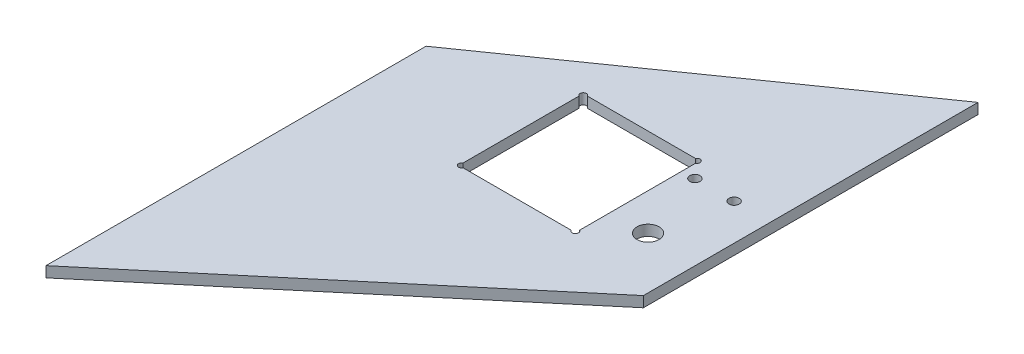
ISO-10303-21;
HEADER;
FILE_DESCRIPTION(('STEP AP214'),'2;1');
FILE_NAME('part.step','',(''),(''),'','','');
FILE_SCHEMA(('AUTOMOTIVE_DESIGN { 1 0 10303 214 1 1 1 1 }'));
ENDSEC;
DATA;
#1=APPLICATION_CONTEXT('core data for automotive mechanical design processes');
#2=APPLICATION_PROTOCOL_DEFINITION('international standard','automotive_design',2000,#1);
#3=PRODUCT_CONTEXT('',#1,'mechanical');
#4=PRODUCT('Part','Part','',(#3));
#5=PRODUCT_RELATED_PRODUCT_CATEGORY('part','',(#4));
#6=PRODUCT_DEFINITION_FORMATION('','',#4);
#7=PRODUCT_DEFINITION_CONTEXT('part definition',#1,'design');
#8=PRODUCT_DEFINITION('design','',#6,#7);
#9=PRODUCT_DEFINITION_SHAPE('','',#8);
#10=(LENGTH_UNIT() NAMED_UNIT(*) SI_UNIT(.MILLI.,.METRE.));
#11=(NAMED_UNIT(*) PLANE_ANGLE_UNIT() SI_UNIT($,.RADIAN.));
#12=(NAMED_UNIT(*) SI_UNIT($,.STERADIAN.) SOLID_ANGLE_UNIT());
#13=UNCERTAINTY_MEASURE_WITH_UNIT(LENGTH_MEASURE(1.E-05),#10,'distance_accuracy_value','');
#14=(GEOMETRIC_REPRESENTATION_CONTEXT(3) GLOBAL_UNCERTAINTY_ASSIGNED_CONTEXT((#13)) GLOBAL_UNIT_ASSIGNED_CONTEXT((#10,
#11,#12)) REPRESENTATION_CONTEXT('',''));
#15=CARTESIAN_POINT('',(0.,0.,0.));
#16=DIRECTION('',(0.,0.,1.));
#17=DIRECTION('',(1.,0.,0.));
#18=AXIS2_PLACEMENT_3D('',#15,#16,#17);
#19=CARTESIAN_POINT('',(0.,-1.27,9.93045313249222));
#20=DIRECTION('',(0.643306704952837,0.,0.765608570591215));
#21=DIRECTION('',(0.765608570591215,0.,-0.643306704952837));
#22=AXIS2_PLACEMENT_3D('',#19,#20,#21);
#23=PLANE('',#22);
#24=DIRECTION('',(0.,1.,0.));
#25=VECTOR('',#24,1.);
#26=CARTESIAN_POINT('',(116.619290139619,-1.27,-88.059530464118));
#27=LINE('',#26,#25);
#28=CARTESIAN_POINT('',(116.619290139619,-1.27,-88.059530464118));
#29=VERTEX_POINT('',#28);
#30=CARTESIAN_POINT('',(116.619290139619,2.54,-88.059530464118));
#31=VERTEX_POINT('',#30);
#32=EDGE_CURVE('E165',#29,#31,#27,.T.);
#33=ORIENTED_EDGE('',*,*,#32,.T.);
#34=DIRECTION('',(0.765608570591215,0.,-0.643306704952837));
#35=VECTOR('',#34,1.);
#36=CARTESIAN_POINT('',(0.,2.54,9.93045313249222));
#37=LINE('',#36,#35);
#38=CARTESIAN_POINT('',(0.,2.54,9.93045313249222));
#39=VERTEX_POINT('',#38);
#40=EDGE_CURVE('E216',#39,#31,#37,.T.);
#41=ORIENTED_EDGE('',*,*,#40,.F.);
#42=DIRECTION('',(0.,1.,0.));
#43=VECTOR('',#42,1.);
#44=CARTESIAN_POINT('',(0.,-1.27,9.93045313249222));
#45=LINE('',#44,#43);
#46=CARTESIAN_POINT('',(0.,-1.27,9.93045313249222));
#47=VERTEX_POINT('',#46);
#48=EDGE_CURVE('E166',#47,#39,#45,.T.);
#49=ORIENTED_EDGE('',*,*,#48,.F.);
#50=DIRECTION('',(0.765608570591215,0.,-0.643306704952837));
#51=VECTOR('',#50,1.);
#52=CARTESIAN_POINT('',(0.,-1.27,9.93045313249222));
#53=LINE('',#52,#51);
#54=EDGE_CURVE('E153',#47,#29,#53,.T.);
#55=ORIENTED_EDGE('',*,*,#54,.T.);
#56=EDGE_LOOP('',(#33,#41,#49,#55));
#57=FACE_BOUND('',#56,.T.);
#58=ADVANCED_FACE('F32',(#57),#23,.T.);
#59=CARTESIAN_POINT('',(0.,-1.27,9.93045313249222));
#60=DIRECTION('',(-1.,0.,0.));
#61=DIRECTION('',(0.,0.,1.));
#62=AXIS2_PLACEMENT_3D('',#59,#60,#61);
#63=PLANE('',#62);
#64=ORIENTED_EDGE('',*,*,#48,.T.);
#65=DIRECTION('',(0.,0.,1.));
#66=VECTOR('',#65,1.);
#67=CARTESIAN_POINT('',(0.,2.54,9.93045313249222));
#68=LINE('',#67,#66);
#69=CARTESIAN_POINT('',(0.,2.54,-126.604027306006));
#70=VERTEX_POINT('',#69);
#71=EDGE_CURVE('E225',#70,#39,#68,.T.);
#72=ORIENTED_EDGE('',*,*,#71,.F.);
#73=DIRECTION('',(0.,1.,0.));
#74=VECTOR('',#73,1.);
#75=CARTESIAN_POINT('',(0.,-1.27,-126.604027306006));
#76=LINE('',#75,#74);
#77=CARTESIAN_POINT('',(0.,-1.27,-126.604027306006));
#78=VERTEX_POINT('',#77);
#79=EDGE_CURVE('E169',#78,#70,#76,.T.);
#80=ORIENTED_EDGE('',*,*,#79,.F.);
#81=DIRECTION('',(0.,0.,1.));
#82=VECTOR('',#81,1.);
#83=CARTESIAN_POINT('',(0.,-1.27,9.93045313249222));
#84=LINE('',#83,#82);
#85=EDGE_CURVE('E162',#78,#47,#84,.T.);
#86=ORIENTED_EDGE('',*,*,#85,.T.);
#87=EDGE_LOOP('',(#64,#72,#80,#86));
#88=FACE_BOUND('',#87,.T.);
#89=ADVANCED_FACE('F249',(#88),#63,.T.);
#90=CARTESIAN_POINT('',(0.,-1.27,-126.604027306006));
#91=DIRECTION('',(-0.573576436351047,0.,-0.819152044288991));
#92=DIRECTION('',(-0.819152044288991,0.,0.573576436351047));
#93=AXIS2_PLACEMENT_3D('',#90,#91,#92);
#94=PLANE('',#93);
#95=ORIENTED_EDGE('',*,*,#79,.T.);
#96=DIRECTION('',(-0.819152044288991,0.,0.573576436351047));
#97=VECTOR('',#96,1.);
#98=CARTESIAN_POINT('',(0.,2.54,-126.604027306006));
#99=LINE('',#98,#97);
#100=CARTESIAN_POINT('',(116.619290139619,2.54,-208.261733362433));
#101=VERTEX_POINT('',#100);
#102=EDGE_CURVE('E222',#101,#70,#99,.T.);
#103=ORIENTED_EDGE('',*,*,#102,.F.);
#104=DIRECTION('',(0.,1.,0.));
#105=VECTOR('',#104,1.);
#106=CARTESIAN_POINT('',(116.619290139619,-1.27,-208.261733362433));
#107=LINE('',#106,#105);
#108=CARTESIAN_POINT('',(116.619290139619,-1.27,-208.261733362433));
#109=VERTEX_POINT('',#108);
#110=EDGE_CURVE('E171',#109,#101,#107,.T.);
#111=ORIENTED_EDGE('',*,*,#110,.F.);
#112=DIRECTION('',(-0.819152044288991,0.,0.573576436351047));
#113=VECTOR('',#112,1.);
#114=CARTESIAN_POINT('',(0.,-1.27,-126.604027306006));
#115=LINE('',#114,#113);
#116=EDGE_CURVE('E159',#109,#78,#115,.T.);
#117=ORIENTED_EDGE('',*,*,#116,.T.);
#118=EDGE_LOOP('',(#95,#103,#111,#117));
#119=FACE_BOUND('',#118,.T.);
#120=ADVANCED_FACE('F254',(#119),#94,.T.);
#121=CARTESIAN_POINT('',(116.619290139619,-1.27,-208.261733362433));
#122=DIRECTION('',(1.,0.,0.));
#123=DIRECTION('',(0.,0.,-1.));
#124=AXIS2_PLACEMENT_3D('',#121,#122,#123);
#125=PLANE('',#124);
#126=ORIENTED_EDGE('',*,*,#110,.T.);
#127=DIRECTION('',(0.,0.,-1.));
#128=VECTOR('',#127,1.);
#129=CARTESIAN_POINT('',(116.619290139619,2.54,-208.261733362433));
#130=LINE('',#129,#128);
#131=EDGE_CURVE('E219',#31,#101,#130,.T.);
#132=ORIENTED_EDGE('',*,*,#131,.F.);
#133=ORIENTED_EDGE('',*,*,#32,.F.);
#134=DIRECTION('',(0.,0.,-1.));
#135=VECTOR('',#134,1.);
#136=CARTESIAN_POINT('',(116.619290139619,-1.27,-208.261733362433));
#137=LINE('',#136,#135);
#138=EDGE_CURVE('E156',#29,#109,#137,.T.);
#139=ORIENTED_EDGE('',*,*,#138,.T.);
#140=EDGE_LOOP('',(#126,#132,#133,#139));
#141=FACE_BOUND('',#140,.T.);
#142=ADVANCED_FACE('F262',(#141),#125,.T.);
#143=CARTESIAN_POINT('',(116.619290139619,-1.27,-88.059530464118));
#144=DIRECTION('',(0.,-1.,0.));
#145=DIRECTION('',(0.,0.,-1.));
#146=AXIS2_PLACEMENT_3D('',#143,#144,#145);
#147=PLANE('',#146);
#148=CARTESIAN_POINT('',(84.3172932249785,-1.27,-95.9237113979477));
#149=DIRECTION('',(0.,1.,0.));
#150=DIRECTION('',(0.,0.,1.));
#151=AXIS2_PLACEMENT_3D('',#148,#149,#150);
#152=CIRCLE('',#151,1.1303);
#153=CARTESIAN_POINT('',(83.3075833210953,-1.27,-95.4157113979477));
#154=VERTEX_POINT('',#153);
#155=CARTESIAN_POINT('',(84.8252932249785,-1.27,-96.933421301831));
#156=VERTEX_POINT('',#155);
#157=EDGE_CURVE('E46',#154,#156,#152,.T.);
#158=ORIENTED_EDGE('',*,*,#157,.T.);
#159=DIRECTION('',(0.,0.,-1.));
#160=VECTOR('',#159,1.);
#161=CARTESIAN_POINT('',(84.8252932249785,-1.27,-138.798911397948));
#162=LINE('',#161,#160);
#163=CARTESIAN_POINT('',(84.8252932249785,-1.27,-138.551201494064));
#164=VERTEX_POINT('',#163);
#165=EDGE_CURVE('E131',#156,#164,#162,.T.);
#166=ORIENTED_EDGE('',*,*,#165,.T.);
#167=CARTESIAN_POINT('',(84.3172932249785,-1.27,-139.560911397948));
#168=DIRECTION('',(0.,1.,0.));
#169=DIRECTION('',(0.,0.,1.));
#170=AXIS2_PLACEMENT_3D('',#167,#168,#169);
#171=CIRCLE('',#170,1.1303);
#172=CARTESIAN_POINT('',(83.3075833210953,-1.27,-140.068911397948));
#173=VERTEX_POINT('',#172);
#174=EDGE_CURVE('E394',#164,#173,#171,.T.);
#175=ORIENTED_EDGE('',*,*,#174,.T.);
#176=DIRECTION('',(-1.,0.,0.));
#177=VECTOR('',#176,1.);
#178=CARTESIAN_POINT('',(42.9822463420664,-1.27,-140.068911397948));
#179=LINE('',#178,#177);
#180=CARTESIAN_POINT('',(44.4999562459497,-1.27,-140.068911397948));
#181=VERTEX_POINT('',#180);
#182=EDGE_CURVE('E184',#173,#181,#179,.T.);
#183=ORIENTED_EDGE('',*,*,#182,.T.);
#184=CARTESIAN_POINT('',(43.4902463420664,-1.27,-139.560911397948));
#185=DIRECTION('',(0.,1.,0.));
#186=DIRECTION('',(0.,0.,1.));
#187=AXIS2_PLACEMENT_3D('',#184,#185,#186);
#188=CIRCLE('',#187,1.13029999999999);
#189=CARTESIAN_POINT('',(42.9822463420664,-1.27,-138.551201494064));
#190=VERTEX_POINT('',#189);
#191=EDGE_CURVE('E196',#181,#190,#188,.T.);
#192=ORIENTED_EDGE('',*,*,#191,.T.);
#193=DIRECTION('',(0.,0.,1.));
#194=VECTOR('',#193,1.);
#195=CARTESIAN_POINT('',(42.9822463420664,-1.27,-138.798911397948));
#196=LINE('',#195,#194);
#197=CARTESIAN_POINT('',(42.9822463420664,-1.27,-96.933421301831));
#198=VERTEX_POINT('',#197);
#199=EDGE_CURVE('E140',#190,#198,#196,.T.);
#200=ORIENTED_EDGE('',*,*,#199,.T.);
#201=CARTESIAN_POINT('',(43.4902463420664,-1.27,-95.9237113979477));
#202=DIRECTION('',(0.,1.,0.));
#203=DIRECTION('',(0.,0.,1.));
#204=AXIS2_PLACEMENT_3D('',#201,#202,#203);
#205=CIRCLE('',#204,1.13029999999999);
#206=CARTESIAN_POINT('',(44.4999562459497,-1.27,-95.4157113979477));
#207=VERTEX_POINT('',#206);
#208=EDGE_CURVE('E389',#198,#207,#205,.T.);
#209=ORIENTED_EDGE('',*,*,#208,.T.);
#210=DIRECTION('',(1.,0.,0.));
#211=VECTOR('',#210,1.);
#212=CARTESIAN_POINT('',(42.9822463420664,-1.27,-95.4157113979477));
#213=LINE('',#212,#211);
#214=EDGE_CURVE('E135',#207,#154,#213,.T.);
#215=ORIENTED_EDGE('',*,*,#214,.T.);
#216=EDGE_LOOP('',(#158,#166,#175,#183,#192,#200,#209,#215));
#217=FACE_BOUND('',#216,.T.);
#218=CARTESIAN_POINT('',(103.545290714358,-1.27,-133.71692050092));
#219=DIRECTION('',(0.,1.,0.));
#220=DIRECTION('',(0.,0.,1.));
#221=AXIS2_PLACEMENT_3D('',#218,#219,#220);
#222=CIRCLE('',#221,1.8288);
#223=CARTESIAN_POINT('',(103.545290714358,-1.27,-131.88812050092));
#224=VERTEX_POINT('',#223);
#225=EDGE_CURVE('E147',#224,#224,#222,.T.);
#226=ORIENTED_EDGE('',*,*,#225,.T.);
#227=EDGE_LOOP('',(#226));
#228=FACE_BOUND('',#227,.T.);
#229=CARTESIAN_POINT('',(89.4586071669914,-1.27,-133.71692050092));
#230=DIRECTION('',(0.,1.,0.));
#231=DIRECTION('',(0.,0.,1.));
#232=AXIS2_PLACEMENT_3D('',#229,#230,#231);
#233=CIRCLE('',#232,1.82880000000002);
#234=CARTESIAN_POINT('',(89.4586071669914,-1.27,-131.88812050092));
#235=VERTEX_POINT('',#234);
#236=EDGE_CURVE('E141',#235,#235,#233,.T.);
#237=ORIENTED_EDGE('',*,*,#236,.T.);
#238=EDGE_LOOP('',(#237));
#239=FACE_BOUND('',#238,.T.);
#240=CARTESIAN_POINT('',(98.0423838871812,-1.27,-108.29992028092));
#241=DIRECTION('',(0.,1.,0.));
#242=DIRECTION('',(0.,0.,1.));
#243=AXIS2_PLACEMENT_3D('',#240,#241,#242);
#244=CIRCLE('',#243,3.96874999999998);
#245=CARTESIAN_POINT('',(98.0423838871812,-1.27,-104.33117028092));
#246=VERTEX_POINT('',#245);
#247=EDGE_CURVE('E144',#246,#246,#244,.T.);
#248=ORIENTED_EDGE('',*,*,#247,.T.);
#249=EDGE_LOOP('',(#248));
#250=FACE_BOUND('',#249,.T.);
#251=ORIENTED_EDGE('',*,*,#54,.F.);
#252=ORIENTED_EDGE('',*,*,#85,.F.);
#253=ORIENTED_EDGE('',*,*,#116,.F.);
#254=ORIENTED_EDGE('',*,*,#138,.F.);
#255=EDGE_LOOP('',(#251,#252,#253,#254));
#256=FACE_BOUND('',#255,.T.);
#257=ADVANCED_FACE('F128',(#217,#228,#239,#250,#256),#147,.T.);
#258=CARTESIAN_POINT('',(98.0423838871812,-1.27,-108.29992028092));
#259=DIRECTION('',(0.,1.,0.));
#260=DIRECTION('',(0.,0.,1.));
#261=AXIS2_PLACEMENT_3D('',#258,#259,#260);
#262=CYLINDRICAL_SURFACE('',#261,3.96874999999998);
#263=ORIENTED_EDGE('',*,*,#247,.F.);
#264=EDGE_LOOP('',(#263));
#265=FACE_BOUND('',#264,.T.);
#266=CARTESIAN_POINT('',(98.0423838871812,2.54,-108.29992028092));
#267=DIRECTION('',(0.,1.,0.));
#268=DIRECTION('',(0.,0.,1.));
#269=AXIS2_PLACEMENT_3D('',#266,#267,#268);
#270=CIRCLE('',#269,3.96874999999998);
#271=CARTESIAN_POINT('',(98.0423838871812,2.54,-104.33117028092));
#272=VERTEX_POINT('',#271);
#273=EDGE_CURVE('E213',#272,#272,#270,.T.);
#274=ORIENTED_EDGE('',*,*,#273,.T.);
#275=EDGE_LOOP('',(#274));
#276=FACE_BOUND('',#275,.T.);
#277=ADVANCED_FACE('F278',(#265,#276),#262,.F.);
#278=CARTESIAN_POINT('',(84.8252932249785,-1.27,-138.798911397948));
#279=DIRECTION('',(1.,0.,0.));
#280=DIRECTION('',(0.,0.,-1.));
#281=AXIS2_PLACEMENT_3D('',#278,#279,#280);
#282=PLANE('',#281);
#283=ORIENTED_EDGE('',*,*,#165,.F.);
#284=DIRECTION('',(0.,1.,0.));
#285=VECTOR('',#284,1.);
#286=CARTESIAN_POINT('',(84.8252932249785,2.54,-96.933421301831));
#287=LINE('',#286,#285);
#288=CARTESIAN_POINT('',(84.8252932249785,2.54,-96.933421301831));
#289=VERTEX_POINT('',#288);
#290=EDGE_CURVE('E118',#156,#289,#287,.T.);
#291=ORIENTED_EDGE('',*,*,#290,.T.);
#292=DIRECTION('',(0.,0.,-1.));
#293=VECTOR('',#292,1.);
#294=CARTESIAN_POINT('',(84.8252932249785,2.54,-138.798911397948));
#295=LINE('',#294,#293);
#296=CARTESIAN_POINT('',(84.8252932249785,2.54,-138.551201494064));
#297=VERTEX_POINT('',#296);
#298=EDGE_CURVE('E208',#289,#297,#295,.T.);
#299=ORIENTED_EDGE('',*,*,#298,.T.);
#300=DIRECTION('',(0.,1.,0.));
#301=VECTOR('',#300,1.);
#302=CARTESIAN_POINT('',(84.8252932249785,2.54,-138.551201494064));
#303=LINE('',#302,#301);
#304=EDGE_CURVE('E139',#297,#164,#303,.F.);
#305=ORIENTED_EDGE('',*,*,#304,.T.);
#306=EDGE_LOOP('',(#283,#291,#299,#305));
#307=FACE_BOUND('',#306,.T.);
#308=ADVANCED_FACE('F138',(#307),#282,.F.);
#309=CARTESIAN_POINT('',(42.9822463420664,-1.27,-138.798911397948));
#310=DIRECTION('',(-1.,0.,0.));
#311=DIRECTION('',(0.,0.,1.));
#312=AXIS2_PLACEMENT_3D('',#309,#310,#311);
#313=PLANE('',#312);
#314=DIRECTION('',(0.,0.,1.));
#315=VECTOR('',#314,1.);
#316=CARTESIAN_POINT('',(42.9822463420664,2.54,-138.798911397948));
#317=LINE('',#316,#315);
#318=CARTESIAN_POINT('',(42.9822463420664,2.54,-138.551201494064));
#319=VERTEX_POINT('',#318);
#320=CARTESIAN_POINT('',(42.9822463420664,2.54,-96.933421301831));
#321=VERTEX_POINT('',#320);
#322=EDGE_CURVE('E210',#319,#321,#317,.T.);
#323=ORIENTED_EDGE('',*,*,#322,.T.);
#324=DIRECTION('',(0.,1.,0.));
#325=VECTOR('',#324,1.);
#326=CARTESIAN_POINT('',(42.9822463420664,2.54,-96.933421301831));
#327=LINE('',#326,#325);
#328=EDGE_CURVE('E387',#321,#198,#327,.F.);
#329=ORIENTED_EDGE('',*,*,#328,.T.);
#330=ORIENTED_EDGE('',*,*,#199,.F.);
#331=DIRECTION('',(0.,1.,0.));
#332=VECTOR('',#331,1.);
#333=CARTESIAN_POINT('',(42.9822463420664,2.54,-138.551201494064));
#334=LINE('',#333,#332);
#335=EDGE_CURVE('E191',#190,#319,#334,.T.);
#336=ORIENTED_EDGE('',*,*,#335,.T.);
#337=EDGE_LOOP('',(#323,#329,#330,#336));
#338=FACE_BOUND('',#337,.T.);
#339=ADVANCED_FACE('F284',(#338),#313,.F.);
#340=CARTESIAN_POINT('',(89.4586071669914,-1.27,-133.71692050092));
#341=DIRECTION('',(0.,1.,0.));
#342=DIRECTION('',(0.,0.,1.));
#343=AXIS2_PLACEMENT_3D('',#340,#341,#342);
#344=CYLINDRICAL_SURFACE('',#343,1.82880000000002);
#345=ORIENTED_EDGE('',*,*,#236,.F.);
#346=EDGE_LOOP('',(#345));
#347=FACE_BOUND('',#346,.T.);
#348=CARTESIAN_POINT('',(89.4586071669914,2.54,-133.71692050092));
#349=DIRECTION('',(0.,1.,0.));
#350=DIRECTION('',(0.,0.,1.));
#351=AXIS2_PLACEMENT_3D('',#348,#349,#350);
#352=CIRCLE('',#351,1.82880000000002);
#353=CARTESIAN_POINT('',(89.4586071669914,2.54,-131.88812050092));
#354=VERTEX_POINT('',#353);
#355=EDGE_CURVE('E205',#354,#354,#352,.T.);
#356=ORIENTED_EDGE('',*,*,#355,.T.);
#357=EDGE_LOOP('',(#356));
#358=FACE_BOUND('',#357,.T.);
#359=ADVANCED_FACE('F234',(#347,#358),#344,.F.);
#360=CARTESIAN_POINT('',(103.545290714358,-1.27,-133.71692050092));
#361=DIRECTION('',(0.,1.,0.));
#362=DIRECTION('',(0.,0.,1.));
#363=AXIS2_PLACEMENT_3D('',#360,#361,#362);
#364=CYLINDRICAL_SURFACE('',#363,1.8288);
#365=ORIENTED_EDGE('',*,*,#225,.F.);
#366=EDGE_LOOP('',(#365));
#367=FACE_BOUND('',#366,.T.);
#368=CARTESIAN_POINT('',(103.545290714358,2.54,-133.71692050092));
#369=DIRECTION('',(0.,1.,0.));
#370=DIRECTION('',(0.,0.,1.));
#371=AXIS2_PLACEMENT_3D('',#368,#369,#370);
#372=CIRCLE('',#371,1.8288);
#373=CARTESIAN_POINT('',(103.545290714358,2.54,-131.88812050092));
#374=VERTEX_POINT('',#373);
#375=EDGE_CURVE('E200',#374,#374,#372,.T.);
#376=ORIENTED_EDGE('',*,*,#375,.T.);
#377=EDGE_LOOP('',(#376));
#378=FACE_BOUND('',#377,.T.);
#379=ADVANCED_FACE('F231',(#367,#378),#364,.F.);
#380=CARTESIAN_POINT('',(116.619290139619,2.54,-88.059530464118));
#381=DIRECTION('',(0.,-1.,0.));
#382=DIRECTION('',(0.,0.,-1.));
#383=AXIS2_PLACEMENT_3D('',#380,#381,#382);
#384=PLANE('',#383);
#385=ORIENTED_EDGE('',*,*,#355,.F.);
#386=EDGE_LOOP('',(#385));
#387=FACE_BOUND('',#386,.T.);
#388=ORIENTED_EDGE('',*,*,#273,.F.);
#389=EDGE_LOOP('',(#388));
#390=FACE_BOUND('',#389,.T.);
#391=ORIENTED_EDGE('',*,*,#40,.T.);
#392=ORIENTED_EDGE('',*,*,#131,.T.);
#393=ORIENTED_EDGE('',*,*,#102,.T.);
#394=ORIENTED_EDGE('',*,*,#71,.T.);
#395=EDGE_LOOP('',(#391,#392,#393,#394));
#396=FACE_BOUND('',#395,.T.);
#397=ORIENTED_EDGE('',*,*,#298,.F.);
#398=CARTESIAN_POINT('',(84.3172932249785,2.54,-95.9237113979477));
#399=DIRECTION('',(0.,1.,0.));
#400=DIRECTION('',(0.,0.,1.));
#401=AXIS2_PLACEMENT_3D('',#398,#399,#400);
#402=CIRCLE('',#401,1.13029999999999);
#403=CARTESIAN_POINT('',(83.3075833210953,2.54,-95.4157113979477));
#404=VERTEX_POINT('',#403);
#405=EDGE_CURVE('E121',#404,#289,#402,.T.);
#406=ORIENTED_EDGE('',*,*,#405,.F.);
#407=DIRECTION('',(1.,0.,0.));
#408=VECTOR('',#407,1.);
#409=CARTESIAN_POINT('',(42.9822463420664,2.54,-95.4157113979477));
#410=LINE('',#409,#408);
#411=CARTESIAN_POINT('',(44.4999562459497,2.54,-95.4157113979477));
#412=VERTEX_POINT('',#411);
#413=EDGE_CURVE('E193',#412,#404,#410,.T.);
#414=ORIENTED_EDGE('',*,*,#413,.F.);
#415=CARTESIAN_POINT('',(43.4902463420664,2.54,-95.9237113979477));
#416=DIRECTION('',(0.,1.,0.));
#417=DIRECTION('',(0.,0.,1.));
#418=AXIS2_PLACEMENT_3D('',#415,#416,#417);
#419=CIRCLE('',#418,1.13029999999999);
#420=EDGE_CURVE('E385',#321,#412,#419,.T.);
#421=ORIENTED_EDGE('',*,*,#420,.F.);
#422=ORIENTED_EDGE('',*,*,#322,.F.);
#423=CARTESIAN_POINT('',(43.4902463420664,2.54,-139.560911397948));
#424=DIRECTION('',(0.,1.,0.));
#425=DIRECTION('',(0.,0.,1.));
#426=AXIS2_PLACEMENT_3D('',#423,#424,#425);
#427=CIRCLE('',#426,1.13029999999999);
#428=CARTESIAN_POINT('',(44.4999562459497,2.54,-140.068911397948));
#429=VERTEX_POINT('',#428);
#430=EDGE_CURVE('E190',#429,#319,#427,.T.);
#431=ORIENTED_EDGE('',*,*,#430,.F.);
#432=DIRECTION('',(-1.,0.,0.));
#433=VECTOR('',#432,1.);
#434=CARTESIAN_POINT('',(42.9822463420664,2.54,-140.068911397948));
#435=LINE('',#434,#433);
#436=CARTESIAN_POINT('',(83.3075833210953,2.54,-140.068911397948));
#437=VERTEX_POINT('',#436);
#438=EDGE_CURVE('E182',#437,#429,#435,.T.);
#439=ORIENTED_EDGE('',*,*,#438,.F.);
#440=CARTESIAN_POINT('',(84.3172932249785,2.54,-139.560911397948));
#441=DIRECTION('',(0.,1.,0.));
#442=DIRECTION('',(0.,0.,1.));
#443=AXIS2_PLACEMENT_3D('',#440,#441,#442);
#444=CIRCLE('',#443,1.13029999999999);
#445=EDGE_CURVE('E53',#297,#437,#444,.T.);
#446=ORIENTED_EDGE('',*,*,#445,.F.);
#447=EDGE_LOOP('',(#397,#406,#414,#421,#422,#431,#439,#446));
#448=FACE_BOUND('',#447,.T.);
#449=ORIENTED_EDGE('',*,*,#375,.F.);
#450=EDGE_LOOP('',(#449));
#451=FACE_BOUND('',#450,.T.);
#452=ADVANCED_FACE('F187',(#387,#390,#396,#448,#451),#384,.F.);
#453=CARTESIAN_POINT('',(42.9822463420664,-1.27,-95.4157113979477));
#454=DIRECTION('',(0.,0.,1.));
#455=DIRECTION('',(0.,-1.,0.));
#456=AXIS2_PLACEMENT_3D('',#453,#454,#455);
#457=PLANE('',#456);
#458=ORIENTED_EDGE('',*,*,#413,.T.);
#459=DIRECTION('',(0.,1.,0.));
#460=VECTOR('',#459,1.);
#461=CARTESIAN_POINT('',(83.3075833210953,2.54,-95.4157113979477));
#462=LINE('',#461,#460);
#463=EDGE_CURVE('E11',#404,#154,#462,.F.);
#464=ORIENTED_EDGE('',*,*,#463,.T.);
#465=ORIENTED_EDGE('',*,*,#214,.F.);
#466=DIRECTION('',(0.,1.,0.));
#467=VECTOR('',#466,1.);
#468=CARTESIAN_POINT('',(44.4999562459497,2.54,-95.4157113979477));
#469=LINE('',#468,#467);
#470=EDGE_CURVE('E176',#207,#412,#469,.T.);
#471=ORIENTED_EDGE('',*,*,#470,.T.);
#472=EDGE_LOOP('',(#458,#464,#465,#471));
#473=FACE_BOUND('',#472,.T.);
#474=ADVANCED_FACE('F238',(#473),#457,.F.);
#475=CARTESIAN_POINT('',(42.9822463420664,-1.27,-140.068911397948));
#476=DIRECTION('',(0.,0.,-1.));
#477=DIRECTION('',(0.,1.,0.));
#478=AXIS2_PLACEMENT_3D('',#475,#476,#477);
#479=PLANE('',#478);
#480=ORIENTED_EDGE('',*,*,#182,.F.);
#481=DIRECTION('',(0.,1.,0.));
#482=VECTOR('',#481,1.);
#483=CARTESIAN_POINT('',(83.3075833210953,2.54,-140.068911397948));
#484=LINE('',#483,#482);
#485=EDGE_CURVE('E39',#173,#437,#484,.T.);
#486=ORIENTED_EDGE('',*,*,#485,.T.);
#487=ORIENTED_EDGE('',*,*,#438,.T.);
#488=DIRECTION('',(0.,1.,0.));
#489=VECTOR('',#488,1.);
#490=CARTESIAN_POINT('',(44.4999562459497,2.54,-140.068911397948));
#491=LINE('',#490,#489);
#492=EDGE_CURVE('E168',#429,#181,#491,.F.);
#493=ORIENTED_EDGE('',*,*,#492,.T.);
#494=EDGE_LOOP('',(#480,#486,#487,#493));
#495=FACE_BOUND('',#494,.T.);
#496=ADVANCED_FACE('F181',(#495),#479,.F.);
#497=CARTESIAN_POINT('',(43.4902463420664,2.54,-139.560911397948));
#498=DIRECTION('',(0.,1.,0.));
#499=DIRECTION('',(0.,0.,1.));
#500=AXIS2_PLACEMENT_3D('',#497,#498,#499);
#501=CYLINDRICAL_SURFACE('',#500,1.13029999999999);
#502=ORIENTED_EDGE('',*,*,#191,.F.);
#503=ORIENTED_EDGE('',*,*,#492,.F.);
#504=ORIENTED_EDGE('',*,*,#430,.T.);
#505=ORIENTED_EDGE('',*,*,#335,.F.);
#506=EDGE_LOOP('',(#502,#503,#504,#505));
#507=FACE_BOUND('',#506,.T.);
#508=ADVANCED_FACE('F344',(#507),#501,.F.);
#509=CARTESIAN_POINT('',(43.4902463420664,2.54,-95.9237113979477));
#510=DIRECTION('',(0.,1.,0.));
#511=DIRECTION('',(0.,0.,1.));
#512=AXIS2_PLACEMENT_3D('',#509,#510,#511);
#513=CYLINDRICAL_SURFACE('',#512,1.13029999999999);
#514=ORIENTED_EDGE('',*,*,#420,.T.);
#515=ORIENTED_EDGE('',*,*,#470,.F.);
#516=ORIENTED_EDGE('',*,*,#208,.F.);
#517=ORIENTED_EDGE('',*,*,#328,.F.);
#518=EDGE_LOOP('',(#514,#515,#516,#517));
#519=FACE_BOUND('',#518,.T.);
#520=ADVANCED_FACE('F353',(#519),#513,.F.);
#521=CARTESIAN_POINT('',(84.3172932249785,2.54,-139.560911397948));
#522=DIRECTION('',(0.,1.,0.));
#523=DIRECTION('',(0.,0.,1.));
#524=AXIS2_PLACEMENT_3D('',#521,#522,#523);
#525=CYLINDRICAL_SURFACE('',#524,1.13029999999999);
#526=ORIENTED_EDGE('',*,*,#445,.T.);
#527=ORIENTED_EDGE('',*,*,#485,.F.);
#528=ORIENTED_EDGE('',*,*,#174,.F.);
#529=ORIENTED_EDGE('',*,*,#304,.F.);
#530=EDGE_LOOP('',(#526,#527,#528,#529));
#531=FACE_BOUND('',#530,.T.);
#532=ADVANCED_FACE('F363',(#531),#525,.F.);
#533=CARTESIAN_POINT('',(84.3172932249785,2.54,-95.9237113979477));
#534=DIRECTION('',(0.,1.,0.));
#535=DIRECTION('',(0.,0.,1.));
#536=AXIS2_PLACEMENT_3D('',#533,#534,#535);
#537=CYLINDRICAL_SURFACE('',#536,1.13029999999999);
#538=ORIENTED_EDGE('',*,*,#157,.F.);
#539=ORIENTED_EDGE('',*,*,#463,.F.);
#540=ORIENTED_EDGE('',*,*,#405,.T.);
#541=ORIENTED_EDGE('',*,*,#290,.F.);
#542=EDGE_LOOP('',(#538,#539,#540,#541));
#543=FACE_BOUND('',#542,.T.);
#544=ADVANCED_FACE('F119',(#543),#537,.F.);
#545=CLOSED_SHELL('',(#58,#89,#120,#142,#257,#277,#308,#339,#359,#379,#452,#474,#496,#508,#520,
#532,#544));
#546=MANIFOLD_SOLID_BREP('B2',#545);
#547=ADVANCED_BREP_SHAPE_REPRESENTATION('',(#18,#546),#14);
#548=SHAPE_DEFINITION_REPRESENTATION(#9,#547);
ENDSEC;
END-ISO-10303-21;
